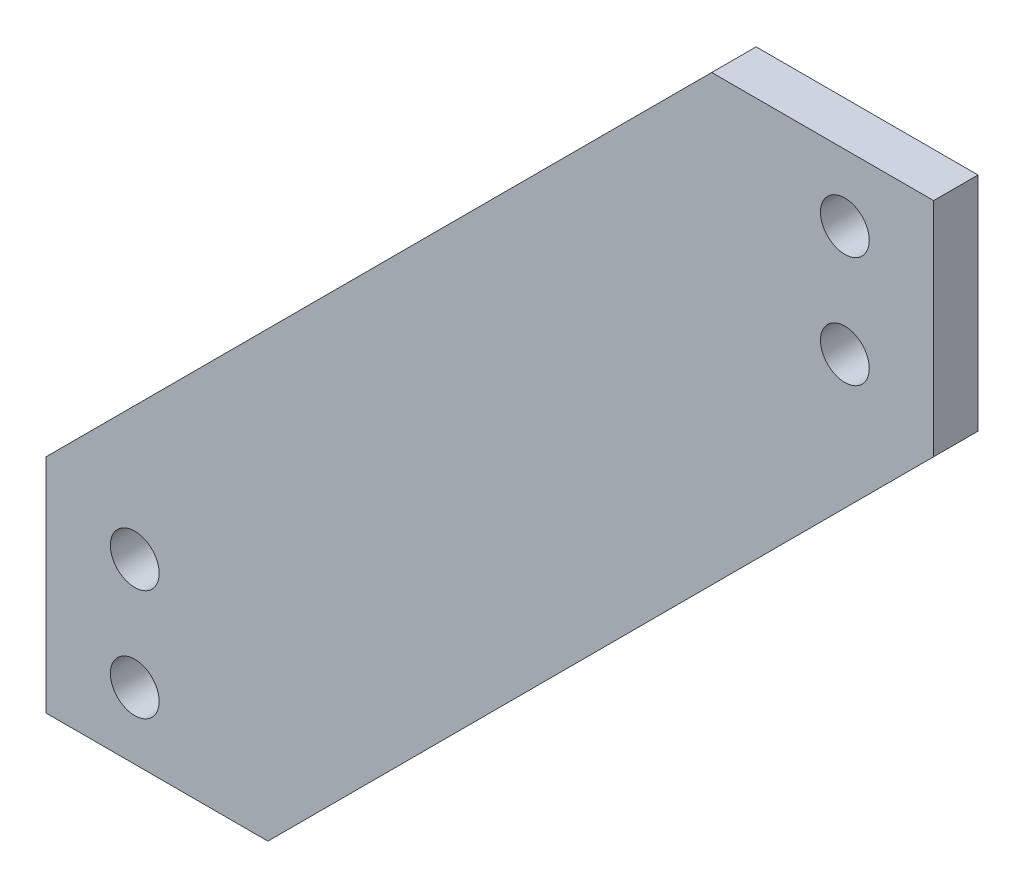
ISO-10303-21;
HEADER;
FILE_DESCRIPTION(('STEP AP214'),'2;1');
FILE_NAME('part.step','',(''),(''),'','','');
FILE_SCHEMA(('AUTOMOTIVE_DESIGN { 1 0 10303 214 1 1 1 1 }'));
ENDSEC;
DATA;
#1=APPLICATION_CONTEXT('core data for automotive mechanical design processes');
#2=APPLICATION_PROTOCOL_DEFINITION('international standard','automotive_design',2000,#1);
#3=PRODUCT_CONTEXT('',#1,'mechanical');
#4=PRODUCT('Part','Part','',(#3));
#5=PRODUCT_RELATED_PRODUCT_CATEGORY('part','',(#4));
#6=PRODUCT_DEFINITION_FORMATION('','',#4);
#7=PRODUCT_DEFINITION_CONTEXT('part definition',#1,'design');
#8=PRODUCT_DEFINITION('design','',#6,#7);
#9=PRODUCT_DEFINITION_SHAPE('','',#8);
#10=(LENGTH_UNIT() NAMED_UNIT(*) SI_UNIT(.MILLI.,.METRE.));
#11=(NAMED_UNIT(*) PLANE_ANGLE_UNIT() SI_UNIT($,.RADIAN.));
#12=(NAMED_UNIT(*) SI_UNIT($,.STERADIAN.) SOLID_ANGLE_UNIT());
#13=UNCERTAINTY_MEASURE_WITH_UNIT(LENGTH_MEASURE(1.E-05),#10,'distance_accuracy_value','');
#14=(GEOMETRIC_REPRESENTATION_CONTEXT(3) GLOBAL_UNCERTAINTY_ASSIGNED_CONTEXT((#13)) GLOBAL_UNIT_ASSIGNED_CONTEXT((#10,
#11,#12)) REPRESENTATION_CONTEXT('',''));
#15=CARTESIAN_POINT('',(0.,0.,0.));
#16=DIRECTION('',(0.,0.,1.));
#17=DIRECTION('',(1.,0.,0.));
#18=AXIS2_PLACEMENT_3D('',#15,#16,#17);
#19=CARTESIAN_POINT('',(0.,0.,-141.42135623731));
#20=DIRECTION('',(-1.,0.,0.));
#21=DIRECTION('',(0.,0.,1.));
#22=AXIS2_PLACEMENT_3D('',#19,#20,#21);
#23=PLANE('',#22);
#24=DIRECTION('',(0.,1.,0.));
#25=VECTOR('',#24,1.);
#26=CARTESIAN_POINT('',(0.,0.,0.));
#27=LINE('',#26,#25);
#28=CARTESIAN_POINT('',(0.,0.,0.));
#29=VERTEX_POINT('',#28);
#30=CARTESIAN_POINT('',(0.,25.,0.));
#31=VERTEX_POINT('',#30);
#32=EDGE_CURVE('E63',#29,#31,#27,.T.);
#33=ORIENTED_EDGE('',*,*,#32,.F.);
#34=DIRECTION('',(0.,0.,-1.));
#35=VECTOR('',#34,1.);
#36=CARTESIAN_POINT('',(0.,0.,5.));
#37=LINE('',#36,#35);
#38=CARTESIAN_POINT('',(0.,0.,5.));
#39=VERTEX_POINT('',#38);
#40=EDGE_CURVE('E11',#39,#29,#37,.T.);
#41=ORIENTED_EDGE('',*,*,#40,.F.);
#42=DIRECTION('',(0.,-1.,0.));
#43=VECTOR('',#42,1.);
#44=CARTESIAN_POINT('',(0.,0.,5.));
#45=LINE('',#44,#43);
#46=CARTESIAN_POINT('',(0.,25.,5.));
#47=VERTEX_POINT('',#46);
#48=EDGE_CURVE('E102',#47,#39,#45,.T.);
#49=ORIENTED_EDGE('',*,*,#48,.F.);
#50=DIRECTION('',(0.,0.,1.));
#51=VECTOR('',#50,1.);
#52=CARTESIAN_POINT('',(0.,25.,-141.42135623731));
#53=LINE('',#52,#51);
#54=EDGE_CURVE('E137',#31,#47,#53,.T.);
#55=ORIENTED_EDGE('',*,*,#54,.F.);
#56=EDGE_LOOP('',(#33,#41,#49,#55));
#57=FACE_BOUND('',#56,.T.);
#58=ADVANCED_FACE('F39',(#57),#23,.T.);
#59=CARTESIAN_POINT('',(0.,25.,-141.42135623731));
#60=DIRECTION('',(-0.707106781186547,0.707106781186547,0.));
#61=DIRECTION('',(-0.707106781186548,-0.707106781186548,0.));
#62=AXIS2_PLACEMENT_3D('',#59,#60,#61);
#63=PLANE('',#62);
#64=DIRECTION('',(0.707106781186548,0.707106781186548,0.));
#65=VECTOR('',#64,1.);
#66=CARTESIAN_POINT('',(0.,25.,0.));
#67=LINE('',#66,#65);
#68=CARTESIAN_POINT('',(75.,100.,0.));
#69=VERTEX_POINT('',#68);
#70=EDGE_CURVE('E163',#31,#69,#67,.T.);
#71=ORIENTED_EDGE('',*,*,#70,.F.);
#72=ORIENTED_EDGE('',*,*,#54,.T.);
#73=DIRECTION('',(-0.707106781186548,-0.707106781186548,0.));
#74=VECTOR('',#73,1.);
#75=CARTESIAN_POINT('',(0.,25.,5.));
#76=LINE('',#75,#74);
#77=CARTESIAN_POINT('',(75.,100.,5.));
#78=VERTEX_POINT('',#77);
#79=EDGE_CURVE('E125',#78,#47,#76,.T.);
#80=ORIENTED_EDGE('',*,*,#79,.F.);
#81=DIRECTION('',(0.,0.,1.));
#82=VECTOR('',#81,1.);
#83=CARTESIAN_POINT('',(75.,100.,-141.42135623731));
#84=LINE('',#83,#82);
#85=EDGE_CURVE('E140',#69,#78,#84,.T.);
#86=ORIENTED_EDGE('',*,*,#85,.F.);
#87=EDGE_LOOP('',(#71,#72,#80,#86));
#88=FACE_BOUND('',#87,.T.);
#89=ADVANCED_FACE('F168',(#88),#63,.T.);
#90=CARTESIAN_POINT('',(0.,0.,5.));
#91=DIRECTION('',(0.,1.,0.));
#92=DIRECTION('',(0.,0.,1.));
#93=AXIS2_PLACEMENT_3D('',#90,#91,#92);
#94=PLANE('',#93);
#95=DIRECTION('',(1.,0.,0.));
#96=VECTOR('',#95,1.);
#97=CARTESIAN_POINT('',(0.,0.,0.));
#98=LINE('',#97,#96);
#99=CARTESIAN_POINT('',(25.,0.,0.));
#100=VERTEX_POINT('',#99);
#101=EDGE_CURVE('E110',#29,#100,#98,.T.);
#102=ORIENTED_EDGE('',*,*,#101,.T.);
#103=DIRECTION('',(0.,0.,1.));
#104=VECTOR('',#103,1.);
#105=CARTESIAN_POINT('',(25.,0.,-141.42135623731));
#106=LINE('',#105,#104);
#107=CARTESIAN_POINT('',(25.,0.,5.));
#108=VERTEX_POINT('',#107);
#109=EDGE_CURVE('E109',#100,#108,#106,.T.);
#110=ORIENTED_EDGE('',*,*,#109,.T.);
#111=DIRECTION('',(1.,0.,0.));
#112=VECTOR('',#111,1.);
#113=CARTESIAN_POINT('',(0.,0.,5.));
#114=LINE('',#113,#112);
#115=EDGE_CURVE('E94',#39,#108,#114,.T.);
#116=ORIENTED_EDGE('',*,*,#115,.F.);
#117=ORIENTED_EDGE('',*,*,#40,.T.);
#118=EDGE_LOOP('',(#102,#110,#116,#117));
#119=FACE_BOUND('',#118,.T.);
#120=ADVANCED_FACE('F41',(#119),#94,.F.);
#121=CARTESIAN_POINT('',(100.,100.,5.));
#122=DIRECTION('',(0.,-1.,0.));
#123=DIRECTION('',(0.,0.,-1.));
#124=AXIS2_PLACEMENT_3D('',#121,#122,#123);
#125=PLANE('',#124);
#126=DIRECTION('',(-1.,0.,0.));
#127=VECTOR('',#126,1.);
#128=CARTESIAN_POINT('',(100.,100.,0.));
#129=LINE('',#128,#127);
#130=CARTESIAN_POINT('',(100.,100.,0.));
#131=VERTEX_POINT('',#130);
#132=EDGE_CURVE('E106',#131,#69,#129,.T.);
#133=ORIENTED_EDGE('',*,*,#132,.T.);
#134=ORIENTED_EDGE('',*,*,#85,.T.);
#135=DIRECTION('',(-1.,0.,0.));
#136=VECTOR('',#135,1.);
#137=CARTESIAN_POINT('',(100.,100.,5.));
#138=LINE('',#137,#136);
#139=CARTESIAN_POINT('',(100.,100.,5.));
#140=VERTEX_POINT('',#139);
#141=EDGE_CURVE('E105',#140,#78,#138,.T.);
#142=ORIENTED_EDGE('',*,*,#141,.F.);
#143=DIRECTION('',(0.,0.,-1.));
#144=VECTOR('',#143,1.);
#145=CARTESIAN_POINT('',(100.,100.,5.));
#146=LINE('',#145,#144);
#147=EDGE_CURVE('E48',#140,#131,#146,.T.);
#148=ORIENTED_EDGE('',*,*,#147,.T.);
#149=EDGE_LOOP('',(#133,#134,#142,#148));
#150=FACE_BOUND('',#149,.T.);
#151=ADVANCED_FACE('F158',(#150),#125,.F.);
#152=CARTESIAN_POINT('',(0.,0.,5.));
#153=DIRECTION('',(0.,0.,1.));
#154=DIRECTION('',(1.,0.,0.));
#155=AXIS2_PLACEMENT_3D('',#152,#153,#154);
#156=PLANE('',#155);
#157=CARTESIAN_POINT('',(10.,20.,5.));
#158=DIRECTION('',(0.,0.,1.));
#159=DIRECTION('',(1.,0.,0.));
#160=AXIS2_PLACEMENT_3D('',#157,#158,#159);
#161=CIRCLE('',#160,2.74999999999999);
#162=CARTESIAN_POINT('',(12.75,20.,5.));
#163=VERTEX_POINT('',#162);
#164=EDGE_CURVE('E295',#163,#163,#161,.T.);
#165=ORIENTED_EDGE('',*,*,#164,.F.);
#166=EDGE_LOOP('',(#165));
#167=FACE_BOUND('',#166,.T.);
#168=CARTESIAN_POINT('',(90.,80.,5.));
#169=DIRECTION('',(0.,0.,1.));
#170=DIRECTION('',(1.,0.,0.));
#171=AXIS2_PLACEMENT_3D('',#168,#169,#170);
#172=CIRCLE('',#171,2.74999999999999);
#173=CARTESIAN_POINT('',(92.75,80.,5.));
#174=VERTEX_POINT('',#173);
#175=EDGE_CURVE('E299',#174,#174,#172,.T.);
#176=ORIENTED_EDGE('',*,*,#175,.F.);
#177=EDGE_LOOP('',(#176));
#178=FACE_BOUND('',#177,.T.);
#179=CARTESIAN_POINT('',(10.,7.5,5.));
#180=DIRECTION('',(0.,0.,1.));
#181=DIRECTION('',(1.,0.,0.));
#182=AXIS2_PLACEMENT_3D('',#179,#180,#181);
#183=CIRCLE('',#182,2.74999999999999);
#184=CARTESIAN_POINT('',(12.75,7.5,5.));
#185=VERTEX_POINT('',#184);
#186=EDGE_CURVE('E309',#185,#185,#183,.T.);
#187=ORIENTED_EDGE('',*,*,#186,.F.);
#188=EDGE_LOOP('',(#187));
#189=FACE_BOUND('',#188,.T.);
#190=CARTESIAN_POINT('',(90.,92.5,5.));
#191=DIRECTION('',(0.,0.,1.));
#192=DIRECTION('',(1.,0.,0.));
#193=AXIS2_PLACEMENT_3D('',#190,#191,#192);
#194=CIRCLE('',#193,2.74999999999999);
#195=CARTESIAN_POINT('',(92.75,92.5,5.));
#196=VERTEX_POINT('',#195);
#197=EDGE_CURVE('E128',#196,#196,#194,.T.);
#198=ORIENTED_EDGE('',*,*,#197,.F.);
#199=EDGE_LOOP('',(#198));
#200=FACE_BOUND('',#199,.T.);
#201=ORIENTED_EDGE('',*,*,#141,.T.);
#202=ORIENTED_EDGE('',*,*,#79,.T.);
#203=ORIENTED_EDGE('',*,*,#48,.T.);
#204=ORIENTED_EDGE('',*,*,#115,.T.);
#205=DIRECTION('',(0.707106781186547,0.707106781186548,0.));
#206=VECTOR('',#205,1.);
#207=CARTESIAN_POINT('',(100.,75.,5.));
#208=LINE('',#207,#206);
#209=CARTESIAN_POINT('',(100.,75.,5.));
#210=VERTEX_POINT('',#209);
#211=EDGE_CURVE('E99',#108,#210,#208,.T.);
#212=ORIENTED_EDGE('',*,*,#211,.T.);
#213=DIRECTION('',(0.,1.,0.));
#214=VECTOR('',#213,1.);
#215=CARTESIAN_POINT('',(100.,100.,5.));
#216=LINE('',#215,#214);
#217=EDGE_CURVE('E120',#210,#140,#216,.T.);
#218=ORIENTED_EDGE('',*,*,#217,.T.);
#219=EDGE_LOOP('',(#201,#202,#203,#204,#212,#218));
#220=FACE_BOUND('',#219,.T.);
#221=ADVANCED_FACE('F96',(#167,#178,#189,#200,#220),#156,.T.);
#222=CARTESIAN_POINT('',(0.,0.,0.));
#223=DIRECTION('',(0.,0.,1.));
#224=DIRECTION('',(1.,0.,0.));
#225=AXIS2_PLACEMENT_3D('',#222,#223,#224);
#226=PLANE('',#225);
#227=CARTESIAN_POINT('',(10.,20.,0.));
#228=DIRECTION('',(0.,0.,1.));
#229=DIRECTION('',(1.,0.,0.));
#230=AXIS2_PLACEMENT_3D('',#227,#228,#229);
#231=CIRCLE('',#230,2.75);
#232=CARTESIAN_POINT('',(12.75,20.,0.));
#233=VERTEX_POINT('',#232);
#234=EDGE_CURVE('E292',#233,#233,#231,.T.);
#235=ORIENTED_EDGE('',*,*,#234,.T.);
#236=EDGE_LOOP('',(#235));
#237=FACE_BOUND('',#236,.T.);
#238=CARTESIAN_POINT('',(90.,80.,0.));
#239=DIRECTION('',(0.,0.,1.));
#240=DIRECTION('',(1.,0.,0.));
#241=AXIS2_PLACEMENT_3D('',#238,#239,#240);
#242=CIRCLE('',#241,2.75);
#243=CARTESIAN_POINT('',(92.75,80.,0.));
#244=VERTEX_POINT('',#243);
#245=EDGE_CURVE('E305',#244,#244,#242,.T.);
#246=ORIENTED_EDGE('',*,*,#245,.T.);
#247=EDGE_LOOP('',(#246));
#248=FACE_BOUND('',#247,.T.);
#249=CARTESIAN_POINT('',(10.,7.5,0.));
#250=DIRECTION('',(0.,0.,1.));
#251=DIRECTION('',(1.,0.,0.));
#252=AXIS2_PLACEMENT_3D('',#249,#250,#251);
#253=CIRCLE('',#252,2.75);
#254=CARTESIAN_POINT('',(12.75,7.5,0.));
#255=VERTEX_POINT('',#254);
#256=EDGE_CURVE('E313',#255,#255,#253,.T.);
#257=ORIENTED_EDGE('',*,*,#256,.T.);
#258=EDGE_LOOP('',(#257));
#259=FACE_BOUND('',#258,.T.);
#260=CARTESIAN_POINT('',(90.,92.5,0.));
#261=DIRECTION('',(0.,0.,1.));
#262=DIRECTION('',(1.,0.,0.));
#263=AXIS2_PLACEMENT_3D('',#260,#261,#262);
#264=CIRCLE('',#263,2.75);
#265=CARTESIAN_POINT('',(92.75,92.5,0.));
#266=VERTEX_POINT('',#265);
#267=EDGE_CURVE('E121',#266,#266,#264,.T.);
#268=ORIENTED_EDGE('',*,*,#267,.T.);
#269=EDGE_LOOP('',(#268));
#270=FACE_BOUND('',#269,.T.);
#271=ORIENTED_EDGE('',*,*,#101,.F.);
#272=ORIENTED_EDGE('',*,*,#32,.T.);
#273=ORIENTED_EDGE('',*,*,#70,.T.);
#274=ORIENTED_EDGE('',*,*,#132,.F.);
#275=DIRECTION('',(0.,-1.,0.));
#276=VECTOR('',#275,1.);
#277=CARTESIAN_POINT('',(100.,100.,0.));
#278=LINE('',#277,#276);
#279=CARTESIAN_POINT('',(100.,75.,0.));
#280=VERTEX_POINT('',#279);
#281=EDGE_CURVE('E55',#131,#280,#278,.T.);
#282=ORIENTED_EDGE('',*,*,#281,.T.);
#283=DIRECTION('',(-0.707106781186547,-0.707106781186548,0.));
#284=VECTOR('',#283,1.);
#285=CARTESIAN_POINT('',(100.,75.,0.));
#286=LINE('',#285,#284);
#287=EDGE_CURVE('E146',#280,#100,#286,.T.);
#288=ORIENTED_EDGE('',*,*,#287,.T.);
#289=EDGE_LOOP('',(#271,#272,#273,#274,#282,#288));
#290=FACE_BOUND('',#289,.T.);
#291=ADVANCED_FACE('F161',(#237,#248,#259,#270,#290),#226,.F.);
#292=CARTESIAN_POINT('',(100.,75.,-141.42135623731));
#293=DIRECTION('',(0.707106781186548,-0.707106781186547,0.));
#294=DIRECTION('',(0.707106781186547,0.707106781186548,0.));
#295=AXIS2_PLACEMENT_3D('',#292,#293,#294);
#296=PLANE('',#295);
#297=ORIENTED_EDGE('',*,*,#287,.F.);
#298=DIRECTION('',(0.,0.,1.));
#299=VECTOR('',#298,1.);
#300=CARTESIAN_POINT('',(100.,75.,-141.42135623731));
#301=LINE('',#300,#299);
#302=EDGE_CURVE('E115',#280,#210,#301,.T.);
#303=ORIENTED_EDGE('',*,*,#302,.T.);
#304=ORIENTED_EDGE('',*,*,#211,.F.);
#305=ORIENTED_EDGE('',*,*,#109,.F.);
#306=EDGE_LOOP('',(#297,#303,#304,#305));
#307=FACE_BOUND('',#306,.T.);
#308=ADVANCED_FACE('F117',(#307),#296,.T.);
#309=CARTESIAN_POINT('',(100.,100.,-141.42135623731));
#310=DIRECTION('',(1.,0.,0.));
#311=DIRECTION('',(0.,0.,-1.));
#312=AXIS2_PLACEMENT_3D('',#309,#310,#311);
#313=PLANE('',#312);
#314=ORIENTED_EDGE('',*,*,#281,.F.);
#315=ORIENTED_EDGE('',*,*,#147,.F.);
#316=ORIENTED_EDGE('',*,*,#217,.F.);
#317=ORIENTED_EDGE('',*,*,#302,.F.);
#318=EDGE_LOOP('',(#314,#315,#316,#317));
#319=FACE_BOUND('',#318,.T.);
#320=ADVANCED_FACE('F179',(#319),#313,.T.);
#321=CARTESIAN_POINT('',(90.,92.5,5.));
#322=DIRECTION('',(0.,0.,1.));
#323=DIRECTION('',(1.,0.,0.));
#324=AXIS2_PLACEMENT_3D('',#321,#322,#323);
#325=CYLINDRICAL_SURFACE('',#324,2.75);
#326=ORIENTED_EDGE('',*,*,#267,.F.);
#327=EDGE_LOOP('',(#326));
#328=FACE_BOUND('',#327,.T.);
#329=ORIENTED_EDGE('',*,*,#197,.T.);
#330=EDGE_LOOP('',(#329));
#331=FACE_BOUND('',#330,.T.);
#332=ADVANCED_FACE('F176',(#328,#331),#325,.F.);
#333=CARTESIAN_POINT('',(10.,7.5,5.));
#334=DIRECTION('',(0.,0.,1.));
#335=DIRECTION('',(1.,0.,0.));
#336=AXIS2_PLACEMENT_3D('',#333,#334,#335);
#337=CYLINDRICAL_SURFACE('',#336,2.74999999999999);
#338=ORIENTED_EDGE('',*,*,#256,.F.);
#339=EDGE_LOOP('',(#338));
#340=FACE_BOUND('',#339,.T.);
#341=ORIENTED_EDGE('',*,*,#186,.T.);
#342=EDGE_LOOP('',(#341));
#343=FACE_BOUND('',#342,.T.);
#344=ADVANCED_FACE('F257',(#340,#343),#337,.F.);
#345=CARTESIAN_POINT('',(90.,80.,5.));
#346=DIRECTION('',(0.,0.,1.));
#347=DIRECTION('',(1.,0.,0.));
#348=AXIS2_PLACEMENT_3D('',#345,#346,#347);
#349=CYLINDRICAL_SURFACE('',#348,2.75);
#350=ORIENTED_EDGE('',*,*,#245,.F.);
#351=EDGE_LOOP('',(#350));
#352=FACE_BOUND('',#351,.T.);
#353=ORIENTED_EDGE('',*,*,#175,.T.);
#354=EDGE_LOOP('',(#353));
#355=FACE_BOUND('',#354,.T.);
#356=ADVANCED_FACE('F266',(#352,#355),#349,.F.);
#357=CARTESIAN_POINT('',(10.,20.,5.));
#358=DIRECTION('',(0.,0.,1.));
#359=DIRECTION('',(1.,0.,0.));
#360=AXIS2_PLACEMENT_3D('',#357,#358,#359);
#361=CYLINDRICAL_SURFACE('',#360,2.74999999999999);
#362=ORIENTED_EDGE('',*,*,#234,.F.);
#363=EDGE_LOOP('',(#362));
#364=FACE_BOUND('',#363,.T.);
#365=ORIENTED_EDGE('',*,*,#164,.T.);
#366=EDGE_LOOP('',(#365));
#367=FACE_BOUND('',#366,.T.);
#368=ADVANCED_FACE('F275',(#364,#367),#361,.F.);
#369=CLOSED_SHELL('',(#58,#89,#120,#151,#221,#291,#308,#320,#332,#344,#356,#368));
#370=MANIFOLD_SOLID_BREP('B2',#369);
#371=ADVANCED_BREP_SHAPE_REPRESENTATION('',(#18,#370),#14);
#372=SHAPE_DEFINITION_REPRESENTATION(#9,#371);
ENDSEC;
END-ISO-10303-21;
